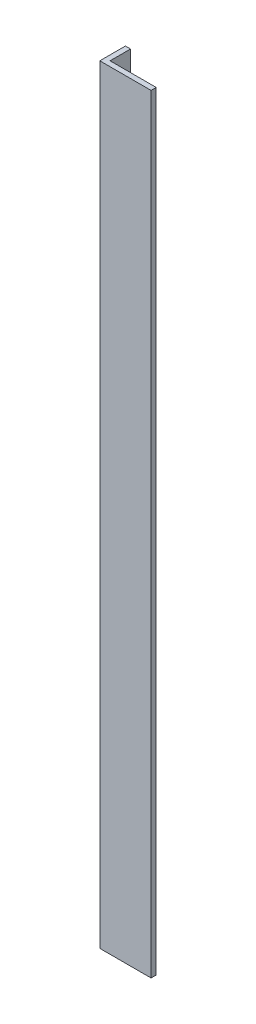
ISO-10303-21;
HEADER;
FILE_DESCRIPTION(('STEP AP214'),'2;1');
FILE_NAME('part.step','',(''),(''),'','','');
FILE_SCHEMA(('AUTOMOTIVE_DESIGN { 1 0 10303 214 1 1 1 1 }'));
ENDSEC;
DATA;
#1=APPLICATION_CONTEXT('core data for automotive mechanical design processes');
#2=APPLICATION_PROTOCOL_DEFINITION('international standard','automotive_design',2000,#1);
#3=PRODUCT_CONTEXT('',#1,'mechanical');
#4=PRODUCT('Part','Part','',(#3));
#5=PRODUCT_RELATED_PRODUCT_CATEGORY('part','',(#4));
#6=PRODUCT_DEFINITION_FORMATION('','',#4);
#7=PRODUCT_DEFINITION_CONTEXT('part definition',#1,'design');
#8=PRODUCT_DEFINITION('design','',#6,#7);
#9=PRODUCT_DEFINITION_SHAPE('','',#8);
#10=(LENGTH_UNIT() NAMED_UNIT(*) SI_UNIT(.MILLI.,.METRE.));
#11=(NAMED_UNIT(*) PLANE_ANGLE_UNIT() SI_UNIT($,.RADIAN.));
#12=(NAMED_UNIT(*) SI_UNIT($,.STERADIAN.) SOLID_ANGLE_UNIT());
#13=UNCERTAINTY_MEASURE_WITH_UNIT(LENGTH_MEASURE(1.E-05),#10,'distance_accuracy_value','');
#14=(GEOMETRIC_REPRESENTATION_CONTEXT(3) GLOBAL_UNCERTAINTY_ASSIGNED_CONTEXT((#13)) GLOBAL_UNIT_ASSIGNED_CONTEXT((#10,
#11,#12)) REPRESENTATION_CONTEXT('',''));
#15=CARTESIAN_POINT('',(0.,0.,0.));
#16=DIRECTION('',(0.,0.,1.));
#17=DIRECTION('',(1.,0.,0.));
#18=AXIS2_PLACEMENT_3D('',#15,#16,#17);
#19=CARTESIAN_POINT('',(20.,300.,0.));
#20=DIRECTION('',(0.,0.,-1.));
#21=DIRECTION('',(-1.,0.,0.));
#22=AXIS2_PLACEMENT_3D('',#19,#20,#21);
#23=PLANE('',#22);
#24=DIRECTION('',(1.,0.,0.));
#25=VECTOR('',#24,1.);
#26=CARTESIAN_POINT('',(20.,0.,0.));
#27=LINE('',#26,#25);
#28=CARTESIAN_POINT('',(0.,0.,0.));
#29=VERTEX_POINT('',#28);
#30=CARTESIAN_POINT('',(20.,0.,0.));
#31=VERTEX_POINT('',#30);
#32=EDGE_CURVE('E121',#29,#31,#27,.T.);
#33=ORIENTED_EDGE('',*,*,#32,.T.);
#34=DIRECTION('',(0.,-1.,0.));
#35=VECTOR('',#34,1.);
#36=CARTESIAN_POINT('',(20.,300.,0.));
#37=LINE('',#36,#35);
#38=CARTESIAN_POINT('',(20.,300.,0.));
#39=VERTEX_POINT('',#38);
#40=EDGE_CURVE('E11',#39,#31,#37,.T.);
#41=ORIENTED_EDGE('',*,*,#40,.F.);
#42=DIRECTION('',(1.,0.,0.));
#43=VECTOR('',#42,1.);
#44=CARTESIAN_POINT('',(20.,300.,0.));
#45=LINE('',#44,#43);
#46=CARTESIAN_POINT('',(0.,300.,0.));
#47=VERTEX_POINT('',#46);
#48=EDGE_CURVE('E132',#47,#39,#45,.T.);
#49=ORIENTED_EDGE('',*,*,#48,.F.);
#50=DIRECTION('',(0.,-1.,0.));
#51=VECTOR('',#50,1.);
#52=CARTESIAN_POINT('',(0.,300.,0.));
#53=LINE('',#52,#51);
#54=EDGE_CURVE('E117',#47,#29,#53,.T.);
#55=ORIENTED_EDGE('',*,*,#54,.T.);
#56=EDGE_LOOP('',(#33,#41,#49,#55));
#57=FACE_BOUND('',#56,.T.);
#58=ADVANCED_FACE('F37',(#57),#23,.F.);
#59=CARTESIAN_POINT('',(20.,300.,-2.));
#60=DIRECTION('',(-1.,0.,0.));
#61=DIRECTION('',(0.,0.,1.));
#62=AXIS2_PLACEMENT_3D('',#59,#60,#61);
#63=PLANE('',#62);
#64=DIRECTION('',(0.,0.,-1.));
#65=VECTOR('',#64,1.);
#66=CARTESIAN_POINT('',(20.,0.,-2.));
#67=LINE('',#66,#65);
#68=CARTESIAN_POINT('',(20.,0.,-2.));
#69=VERTEX_POINT('',#68);
#70=EDGE_CURVE('E124',#31,#69,#67,.T.);
#71=ORIENTED_EDGE('',*,*,#70,.T.);
#72=DIRECTION('',(0.,-1.,0.));
#73=VECTOR('',#72,1.);
#74=CARTESIAN_POINT('',(20.,300.,-2.));
#75=LINE('',#74,#73);
#76=CARTESIAN_POINT('',(20.,300.,-2.));
#77=VERTEX_POINT('',#76);
#78=EDGE_CURVE('E45',#77,#69,#75,.T.);
#79=ORIENTED_EDGE('',*,*,#78,.F.);
#80=DIRECTION('',(0.,0.,-1.));
#81=VECTOR('',#80,1.);
#82=CARTESIAN_POINT('',(20.,300.,-2.));
#83=LINE('',#82,#81);
#84=EDGE_CURVE('E90',#39,#77,#83,.T.);
#85=ORIENTED_EDGE('',*,*,#84,.F.);
#86=ORIENTED_EDGE('',*,*,#40,.T.);
#87=EDGE_LOOP('',(#71,#79,#85,#86));
#88=FACE_BOUND('',#87,.T.);
#89=ADVANCED_FACE('F161',(#88),#63,.F.);
#90=CARTESIAN_POINT('',(2.,300.,-2.));
#91=DIRECTION('',(0.,0.,1.));
#92=DIRECTION('',(1.,0.,0.));
#93=AXIS2_PLACEMENT_3D('',#90,#91,#92);
#94=PLANE('',#93);
#95=DIRECTION('',(-1.,0.,0.));
#96=VECTOR('',#95,1.);
#97=CARTESIAN_POINT('',(2.,0.,-2.));
#98=LINE('',#97,#96);
#99=CARTESIAN_POINT('',(2.,0.,-2.));
#100=VERTEX_POINT('',#99);
#101=EDGE_CURVE('E127',#69,#100,#98,.T.);
#102=ORIENTED_EDGE('',*,*,#101,.T.);
#103=DIRECTION('',(0.,-1.,0.));
#104=VECTOR('',#103,1.);
#105=CARTESIAN_POINT('',(2.,300.,-2.));
#106=LINE('',#105,#104);
#107=CARTESIAN_POINT('',(2.,300.,-2.));
#108=VERTEX_POINT('',#107);
#109=EDGE_CURVE('E112',#108,#100,#106,.T.);
#110=ORIENTED_EDGE('',*,*,#109,.F.);
#111=DIRECTION('',(-1.,0.,0.));
#112=VECTOR('',#111,1.);
#113=CARTESIAN_POINT('',(2.,300.,-2.));
#114=LINE('',#113,#112);
#115=EDGE_CURVE('E103',#77,#108,#114,.T.);
#116=ORIENTED_EDGE('',*,*,#115,.F.);
#117=ORIENTED_EDGE('',*,*,#78,.T.);
#118=EDGE_LOOP('',(#102,#110,#116,#117));
#119=FACE_BOUND('',#118,.T.);
#120=ADVANCED_FACE('F138',(#119),#94,.F.);
#121=CARTESIAN_POINT('',(2.,300.,-10.));
#122=DIRECTION('',(-1.,0.,0.));
#123=DIRECTION('',(0.,0.,1.));
#124=AXIS2_PLACEMENT_3D('',#121,#122,#123);
#125=PLANE('',#124);
#126=CARTESIAN_POINT('',(2.,211.25,-7.25000000000001));
#127=DIRECTION('',(-1.,0.,0.));
#128=DIRECTION('',(0.,0.,1.));
#129=AXIS2_PLACEMENT_3D('',#126,#127,#128);
#130=CIRCLE('',#129,1.49999999999999);
#131=CARTESIAN_POINT('',(2.,211.25,-5.75000000000002));
#132=VERTEX_POINT('',#131);
#133=EDGE_CURVE('E177',#132,#132,#130,.T.);
#134=ORIENTED_EDGE('',*,*,#133,.T.);
#135=EDGE_LOOP('',(#134));
#136=FACE_BOUND('',#135,.T.);
#137=CARTESIAN_POINT('',(2.,2.74999999999997,-7.25000000000003));
#138=DIRECTION('',(-1.,0.,0.));
#139=DIRECTION('',(0.,0.,1.));
#140=AXIS2_PLACEMENT_3D('',#137,#138,#139);
#141=CIRCLE('',#140,1.49999999999999);
#142=CARTESIAN_POINT('',(2.,2.74999999999997,-5.75000000000004));
#143=VERTEX_POINT('',#142);
#144=EDGE_CURVE('E125',#143,#143,#141,.T.);
#145=ORIENTED_EDGE('',*,*,#144,.T.);
#146=EDGE_LOOP('',(#145));
#147=FACE_BOUND('',#146,.T.);
#148=DIRECTION('',(0.,0.,-1.));
#149=VECTOR('',#148,1.);
#150=CARTESIAN_POINT('',(2.,0.,-10.));
#151=LINE('',#150,#149);
#152=CARTESIAN_POINT('',(2.,0.,-10.));
#153=VERTEX_POINT('',#152);
#154=EDGE_CURVE('E111',#100,#153,#151,.T.);
#155=ORIENTED_EDGE('',*,*,#154,.T.);
#156=DIRECTION('',(0.,-1.,0.));
#157=VECTOR('',#156,1.);
#158=CARTESIAN_POINT('',(2.,300.,-10.));
#159=LINE('',#158,#157);
#160=CARTESIAN_POINT('',(2.,300.,-10.));
#161=VERTEX_POINT('',#160);
#162=EDGE_CURVE('E108',#161,#153,#159,.T.);
#163=ORIENTED_EDGE('',*,*,#162,.F.);
#164=DIRECTION('',(0.,0.,-1.));
#165=VECTOR('',#164,1.);
#166=CARTESIAN_POINT('',(2.,300.,-10.));
#167=LINE('',#166,#165);
#168=EDGE_CURVE('E97',#108,#161,#167,.T.);
#169=ORIENTED_EDGE('',*,*,#168,.F.);
#170=ORIENTED_EDGE('',*,*,#109,.T.);
#171=EDGE_LOOP('',(#155,#163,#169,#170));
#172=FACE_BOUND('',#171,.T.);
#173=ADVANCED_FACE('F109',(#136,#147,#172),#125,.F.);
#174=CARTESIAN_POINT('',(0.,300.,-10.));
#175=DIRECTION('',(0.,0.,1.));
#176=DIRECTION('',(1.,0.,0.));
#177=AXIS2_PLACEMENT_3D('',#174,#175,#176);
#178=PLANE('',#177);
#179=DIRECTION('',(-1.,0.,0.));
#180=VECTOR('',#179,1.);
#181=CARTESIAN_POINT('',(0.,0.,-10.));
#182=LINE('',#181,#180);
#183=CARTESIAN_POINT('',(0.,0.,-10.));
#184=VERTEX_POINT('',#183);
#185=EDGE_CURVE('E76',#153,#184,#182,.T.);
#186=ORIENTED_EDGE('',*,*,#185,.T.);
#187=DIRECTION('',(0.,-1.,0.));
#188=VECTOR('',#187,1.);
#189=CARTESIAN_POINT('',(0.,300.,-10.));
#190=LINE('',#189,#188);
#191=CARTESIAN_POINT('',(0.,300.,-10.));
#192=VERTEX_POINT('',#191);
#193=EDGE_CURVE('E113',#192,#184,#190,.T.);
#194=ORIENTED_EDGE('',*,*,#193,.F.);
#195=DIRECTION('',(-1.,0.,0.));
#196=VECTOR('',#195,1.);
#197=CARTESIAN_POINT('',(0.,300.,-10.));
#198=LINE('',#197,#196);
#199=EDGE_CURVE('E101',#161,#192,#198,.T.);
#200=ORIENTED_EDGE('',*,*,#199,.F.);
#201=ORIENTED_EDGE('',*,*,#162,.T.);
#202=EDGE_LOOP('',(#186,#194,#200,#201));
#203=FACE_BOUND('',#202,.T.);
#204=ADVANCED_FACE('F115',(#203),#178,.F.);
#205=CARTESIAN_POINT('',(0.,300.,0.));
#206=DIRECTION('',(1.,0.,0.));
#207=DIRECTION('',(0.,0.,-1.));
#208=AXIS2_PLACEMENT_3D('',#205,#206,#207);
#209=PLANE('',#208);
#210=CARTESIAN_POINT('',(0.,288.000001131567,-6.00000053841696));
#211=DIRECTION('',(1.,0.,0.));
#212=DIRECTION('',(0.,0.,-1.));
#213=AXIS2_PLACEMENT_3D('',#210,#211,#212);
#214=CIRCLE('',#213,1.5);
#215=CARTESIAN_POINT('',(0.,288.000001131567,-7.50000053841696));
#216=VERTEX_POINT('',#215);
#217=EDGE_CURVE('E198',#216,#216,#214,.T.);
#218=ORIENTED_EDGE('',*,*,#217,.T.);
#219=EDGE_LOOP('',(#218));
#220=FACE_BOUND('',#219,.T.);
#221=CARTESIAN_POINT('',(0.,264.000001131567,-6.00000053841696));
#222=DIRECTION('',(1.,0.,0.));
#223=DIRECTION('',(0.,0.,-1.));
#224=AXIS2_PLACEMENT_3D('',#221,#222,#223);
#225=CIRCLE('',#224,1.5);
#226=CARTESIAN_POINT('',(0.,264.000001131567,-7.50000053841696));
#227=VERTEX_POINT('',#226);
#228=EDGE_CURVE('E192',#227,#227,#225,.T.);
#229=ORIENTED_EDGE('',*,*,#228,.T.);
#230=EDGE_LOOP('',(#229));
#231=FACE_BOUND('',#230,.T.);
#232=CARTESIAN_POINT('',(0.,211.25,-7.25000000000001));
#233=DIRECTION('',(-1.,0.,0.));
#234=DIRECTION('',(0.,0.,1.));
#235=AXIS2_PLACEMENT_3D('',#232,#233,#234);
#236=CIRCLE('',#235,1.49999999999997);
#237=CARTESIAN_POINT('',(0.,211.25,-5.75000000000003));
#238=VERTEX_POINT('',#237);
#239=EDGE_CURVE('E189',#238,#238,#236,.T.);
#240=ORIENTED_EDGE('',*,*,#239,.F.);
#241=EDGE_LOOP('',(#240));
#242=FACE_BOUND('',#241,.T.);
#243=CARTESIAN_POINT('',(0.,2.74999999999997,-7.25000000000003));
#244=DIRECTION('',(-1.,0.,0.));
#245=DIRECTION('',(0.,0.,1.));
#246=AXIS2_PLACEMENT_3D('',#243,#244,#245);
#247=CIRCLE('',#246,1.49999999999999);
#248=CARTESIAN_POINT('',(0.,2.74999999999997,-5.75000000000005));
#249=VERTEX_POINT('',#248);
#250=EDGE_CURVE('E181',#249,#249,#247,.T.);
#251=ORIENTED_EDGE('',*,*,#250,.F.);
#252=EDGE_LOOP('',(#251));
#253=FACE_BOUND('',#252,.T.);
#254=DIRECTION('',(0.,0.,1.));
#255=VECTOR('',#254,1.);
#256=CARTESIAN_POINT('',(0.,0.,0.));
#257=LINE('',#256,#255);
#258=EDGE_CURVE('E82',#184,#29,#257,.T.);
#259=ORIENTED_EDGE('',*,*,#258,.T.);
#260=ORIENTED_EDGE('',*,*,#54,.F.);
#261=DIRECTION('',(0.,0.,1.));
#262=VECTOR('',#261,1.);
#263=CARTESIAN_POINT('',(0.,300.,0.));
#264=LINE('',#263,#262);
#265=EDGE_CURVE('E53',#192,#47,#264,.T.);
#266=ORIENTED_EDGE('',*,*,#265,.F.);
#267=ORIENTED_EDGE('',*,*,#193,.T.);
#268=EDGE_LOOP('',(#259,#260,#266,#267));
#269=FACE_BOUND('',#268,.T.);
#270=ADVANCED_FACE('F145',(#220,#231,#242,#253,#269),#209,.F.);
#271=CARTESIAN_POINT('',(0.,300.,0.));
#272=DIRECTION('',(0.,-1.,0.));
#273=DIRECTION('',(0.,0.,-1.));
#274=AXIS2_PLACEMENT_3D('',#271,#272,#273);
#275=PLANE('',#274);
#276=ORIENTED_EDGE('',*,*,#48,.T.);
#277=ORIENTED_EDGE('',*,*,#84,.T.);
#278=ORIENTED_EDGE('',*,*,#115,.T.);
#279=ORIENTED_EDGE('',*,*,#168,.T.);
#280=ORIENTED_EDGE('',*,*,#199,.T.);
#281=ORIENTED_EDGE('',*,*,#265,.T.);
#282=EDGE_LOOP('',(#276,#277,#278,#279,#280,#281));
#283=FACE_BOUND('',#282,.T.);
#284=ADVANCED_FACE('F99',(#283),#275,.F.);
#285=CARTESIAN_POINT('',(0.,0.,0.));
#286=DIRECTION('',(0.,-1.,0.));
#287=DIRECTION('',(0.,0.,-1.));
#288=AXIS2_PLACEMENT_3D('',#285,#286,#287);
#289=PLANE('',#288);
#290=ORIENTED_EDGE('',*,*,#32,.F.);
#291=ORIENTED_EDGE('',*,*,#258,.F.);
#292=ORIENTED_EDGE('',*,*,#185,.F.);
#293=ORIENTED_EDGE('',*,*,#154,.F.);
#294=ORIENTED_EDGE('',*,*,#101,.F.);
#295=ORIENTED_EDGE('',*,*,#70,.F.);
#296=EDGE_LOOP('',(#290,#291,#292,#293,#294,#295));
#297=FACE_BOUND('',#296,.T.);
#298=ADVANCED_FACE('F141',(#297),#289,.T.);
#299=CARTESIAN_POINT('',(0.,2.74999999999997,-7.25000000000003));
#300=DIRECTION('',(-1.,0.,0.));
#301=DIRECTION('',(0.,0.,1.));
#302=AXIS2_PLACEMENT_3D('',#299,#300,#301);
#303=CYLINDRICAL_SURFACE('',#302,1.49999999999999);
#304=ORIENTED_EDGE('',*,*,#144,.F.);
#305=EDGE_LOOP('',(#304));
#306=FACE_BOUND('',#305,.T.);
#307=ORIENTED_EDGE('',*,*,#250,.T.);
#308=EDGE_LOOP('',(#307));
#309=FACE_BOUND('',#308,.T.);
#310=ADVANCED_FACE('F226',(#306,#309),#303,.F.);
#311=CARTESIAN_POINT('',(0.,211.25,-7.25000000000001));
#312=DIRECTION('',(-1.,0.,0.));
#313=DIRECTION('',(0.,0.,1.));
#314=AXIS2_PLACEMENT_3D('',#311,#312,#313);
#315=CYLINDRICAL_SURFACE('',#314,1.49999999999999);
#316=ORIENTED_EDGE('',*,*,#133,.F.);
#317=EDGE_LOOP('',(#316));
#318=FACE_BOUND('',#317,.T.);
#319=ORIENTED_EDGE('',*,*,#239,.T.);
#320=EDGE_LOOP('',(#319));
#321=FACE_BOUND('',#320,.T.);
#322=ADVANCED_FACE('F222',(#318,#321),#315,.F.);
#323=CARTESIAN_POINT('',(1.99998505053091,265.500001131567,-6.00000053841696));
#324=DIRECTION('',(1.,0.,0.));
#325=DIRECTION('',(0.,0.,-1.));
#326=AXIS2_PLACEMENT_3D('',#323,#324,#325);
#327=PLANE('',#326);
#328=CARTESIAN_POINT('',(1.99998505053091,264.000001131567,-6.00000053841696));
#329=DIRECTION('',(1.,0.,0.));
#330=DIRECTION('',(0.,0.,-1.));
#331=AXIS2_PLACEMENT_3D('',#328,#329,#330);
#332=CIRCLE('',#331,1.5);
#333=CARTESIAN_POINT('',(1.99998505053091,264.000001131567,-7.50000053841696));
#334=VERTEX_POINT('',#333);
#335=EDGE_CURVE('E195',#334,#334,#332,.T.);
#336=ORIENTED_EDGE('',*,*,#335,.F.);
#337=EDGE_LOOP('',(#336));
#338=FACE_BOUND('',#337,.T.);
#339=ADVANCED_FACE('F216',(#338),#327,.F.);
#340=CARTESIAN_POINT('',(1.99998505053091,264.000001131567,-6.00000053841696));
#341=DIRECTION('',(1.,0.,0.));
#342=DIRECTION('',(0.,0.,-1.));
#343=AXIS2_PLACEMENT_3D('',#340,#341,#342);
#344=CYLINDRICAL_SURFACE('',#343,1.5);
#345=ORIENTED_EDGE('',*,*,#228,.F.);
#346=EDGE_LOOP('',(#345));
#347=FACE_BOUND('',#346,.T.);
#348=ORIENTED_EDGE('',*,*,#335,.T.);
#349=EDGE_LOOP('',(#348));
#350=FACE_BOUND('',#349,.T.);
#351=ADVANCED_FACE('F208',(#347,#350),#344,.F.);
#352=CARTESIAN_POINT('',(1.99998505053091,289.500001131567,-6.00000053841696));
#353=DIRECTION('',(1.,0.,0.));
#354=DIRECTION('',(0.,0.,-1.));
#355=AXIS2_PLACEMENT_3D('',#352,#353,#354);
#356=PLANE('',#355);
#357=CARTESIAN_POINT('',(1.99998505053091,288.000001131567,-6.00000053841696));
#358=DIRECTION('',(1.,0.,0.));
#359=DIRECTION('',(0.,0.,-1.));
#360=AXIS2_PLACEMENT_3D('',#357,#358,#359);
#361=CIRCLE('',#360,1.5);
#362=CARTESIAN_POINT('',(1.99998505053091,288.000001131567,-7.50000053841696));
#363=VERTEX_POINT('',#362);
#364=EDGE_CURVE('E200',#363,#363,#361,.T.);
#365=ORIENTED_EDGE('',*,*,#364,.F.);
#366=EDGE_LOOP('',(#365));
#367=FACE_BOUND('',#366,.T.);
#368=ADVANCED_FACE('F206',(#367),#356,.F.);
#369=CARTESIAN_POINT('',(1.99998505053091,288.000001131567,-6.00000053841696));
#370=DIRECTION('',(1.,0.,0.));
#371=DIRECTION('',(0.,0.,-1.));
#372=AXIS2_PLACEMENT_3D('',#369,#370,#371);
#373=CYLINDRICAL_SURFACE('',#372,1.5);
#374=ORIENTED_EDGE('',*,*,#217,.F.);
#375=EDGE_LOOP('',(#374));
#376=FACE_BOUND('',#375,.T.);
#377=ORIENTED_EDGE('',*,*,#364,.T.);
#378=EDGE_LOOP('',(#377));
#379=FACE_BOUND('',#378,.T.);
#380=ADVANCED_FACE('F204',(#376,#379),#373,.F.);
#381=CLOSED_SHELL('',(#58,#89,#120,#173,#204,#270,#284,#298,#310,#322,#339,#351,#368,#380));
#382=MANIFOLD_SOLID_BREP('B2',#381);
#383=ADVANCED_BREP_SHAPE_REPRESENTATION('',(#18,#382),#14);
#384=SHAPE_DEFINITION_REPRESENTATION(#9,#383);
ENDSEC;
END-ISO-10303-21;
